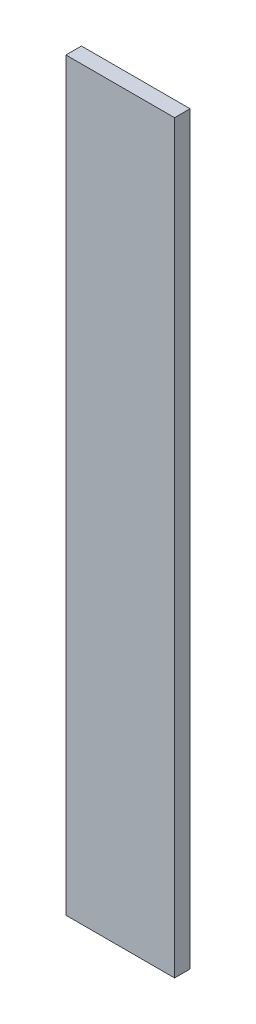
ISO-10303-21;
HEADER;
FILE_DESCRIPTION(('STEP AP214'),'2;1');
FILE_NAME('part.step','',(''),(''),'','','');
FILE_SCHEMA(('AUTOMOTIVE_DESIGN { 1 0 10303 214 1 1 1 1 }'));
ENDSEC;
DATA;
#1=APPLICATION_CONTEXT('core data for automotive mechanical design processes');
#2=APPLICATION_PROTOCOL_DEFINITION('international standard','automotive_design',2000,#1);
#3=PRODUCT_CONTEXT('',#1,'mechanical');
#4=PRODUCT('Part','Part','',(#3));
#5=PRODUCT_RELATED_PRODUCT_CATEGORY('part','',(#4));
#6=PRODUCT_DEFINITION_FORMATION('','',#4);
#7=PRODUCT_DEFINITION_CONTEXT('part definition',#1,'design');
#8=PRODUCT_DEFINITION('design','',#6,#7);
#9=PRODUCT_DEFINITION_SHAPE('','',#8);
#10=(LENGTH_UNIT() NAMED_UNIT(*) SI_UNIT(.MILLI.,.METRE.));
#11=(NAMED_UNIT(*) PLANE_ANGLE_UNIT() SI_UNIT($,.RADIAN.));
#12=(NAMED_UNIT(*) SI_UNIT($,.STERADIAN.) SOLID_ANGLE_UNIT());
#13=UNCERTAINTY_MEASURE_WITH_UNIT(LENGTH_MEASURE(1.E-05),#10,'distance_accuracy_value','');
#14=(GEOMETRIC_REPRESENTATION_CONTEXT(3) GLOBAL_UNCERTAINTY_ASSIGNED_CONTEXT((#13)) GLOBAL_UNIT_ASSIGNED_CONTEXT((#10,
#11,#12)) REPRESENTATION_CONTEXT('',''));
#15=CARTESIAN_POINT('',(0.,0.,0.));
#16=DIRECTION('',(0.,0.,1.));
#17=DIRECTION('',(1.,0.,0.));
#18=AXIS2_PLACEMENT_3D('',#15,#16,#17);
#19=CARTESIAN_POINT('',(0.,304.8,0.));
#20=DIRECTION('',(1.,0.,0.));
#21=DIRECTION('',(0.,0.,-1.));
#22=AXIS2_PLACEMENT_3D('',#19,#20,#21);
#23=PLANE('',#22);
#24=DIRECTION('',(0.,0.,1.));
#25=VECTOR('',#24,1.);
#26=CARTESIAN_POINT('',(0.,0.,0.));
#27=LINE('',#26,#25);
#28=CARTESIAN_POINT('',(0.,0.,-6.35));
#29=VERTEX_POINT('',#28);
#30=CARTESIAN_POINT('',(0.,0.,0.));
#31=VERTEX_POINT('',#30);
#32=EDGE_CURVE('E102',#29,#31,#27,.T.);
#33=ORIENTED_EDGE('',*,*,#32,.T.);
#34=DIRECTION('',(0.,-1.,0.));
#35=VECTOR('',#34,1.);
#36=CARTESIAN_POINT('',(0.,304.8,0.));
#37=LINE('',#36,#35);
#38=CARTESIAN_POINT('',(0.,304.8,0.));
#39=VERTEX_POINT('',#38);
#40=EDGE_CURVE('E11',#39,#31,#37,.T.);
#41=ORIENTED_EDGE('',*,*,#40,.F.);
#42=DIRECTION('',(0.,0.,1.));
#43=VECTOR('',#42,1.);
#44=CARTESIAN_POINT('',(0.,304.8,0.));
#45=LINE('',#44,#43);
#46=CARTESIAN_POINT('',(0.,304.8,-6.35));
#47=VERTEX_POINT('',#46);
#48=EDGE_CURVE('E90',#47,#39,#45,.T.);
#49=ORIENTED_EDGE('',*,*,#48,.F.);
#50=DIRECTION('',(0.,-1.,0.));
#51=VECTOR('',#50,1.);
#52=CARTESIAN_POINT('',(0.,304.8,-6.35));
#53=LINE('',#52,#51);
#54=EDGE_CURVE('E98',#47,#29,#53,.T.);
#55=ORIENTED_EDGE('',*,*,#54,.T.);
#56=EDGE_LOOP('',(#33,#41,#49,#55));
#57=FACE_BOUND('',#56,.T.);
#58=ADVANCED_FACE('F39',(#57),#23,.F.);
#59=CARTESIAN_POINT('',(0.,304.8,0.));
#60=DIRECTION('',(0.,0.,-1.));
#61=DIRECTION('',(-1.,0.,0.));
#62=AXIS2_PLACEMENT_3D('',#59,#60,#61);
#63=PLANE('',#62);
#64=DIRECTION('',(1.,0.,0.));
#65=VECTOR('',#64,1.);
#66=CARTESIAN_POINT('',(0.,0.,0.));
#67=LINE('',#66,#65);
#68=CARTESIAN_POINT('',(44.45,0.,0.));
#69=VERTEX_POINT('',#68);
#70=EDGE_CURVE('E94',#31,#69,#67,.T.);
#71=ORIENTED_EDGE('',*,*,#70,.T.);
#72=DIRECTION('',(0.,-1.,0.));
#73=VECTOR('',#72,1.);
#74=CARTESIAN_POINT('',(44.45,304.8,0.));
#75=LINE('',#74,#73);
#76=CARTESIAN_POINT('',(44.45,304.8,0.));
#77=VERTEX_POINT('',#76);
#78=EDGE_CURVE('E47',#77,#69,#75,.T.);
#79=ORIENTED_EDGE('',*,*,#78,.F.);
#80=DIRECTION('',(1.,0.,0.));
#81=VECTOR('',#80,1.);
#82=CARTESIAN_POINT('',(0.,304.8,0.));
#83=LINE('',#82,#81);
#84=EDGE_CURVE('E85',#39,#77,#83,.T.);
#85=ORIENTED_EDGE('',*,*,#84,.F.);
#86=ORIENTED_EDGE('',*,*,#40,.T.);
#87=EDGE_LOOP('',(#71,#79,#85,#86));
#88=FACE_BOUND('',#87,.T.);
#89=ADVANCED_FACE('F93',(#88),#63,.F.);
#90=CARTESIAN_POINT('',(44.45,304.8,0.));
#91=DIRECTION('',(-1.,0.,0.));
#92=DIRECTION('',(0.,0.,1.));
#93=AXIS2_PLACEMENT_3D('',#90,#91,#92);
#94=PLANE('',#93);
#95=DIRECTION('',(0.,0.,-1.));
#96=VECTOR('',#95,1.);
#97=CARTESIAN_POINT('',(44.45,0.,0.));
#98=LINE('',#97,#96);
#99=CARTESIAN_POINT('',(44.45,0.,-6.35));
#100=VERTEX_POINT('',#99);
#101=EDGE_CURVE('E72',#69,#100,#98,.T.);
#102=ORIENTED_EDGE('',*,*,#101,.T.);
#103=DIRECTION('',(0.,-1.,0.));
#104=VECTOR('',#103,1.);
#105=CARTESIAN_POINT('',(44.45,304.8,-6.35));
#106=LINE('',#105,#104);
#107=CARTESIAN_POINT('',(44.45,304.8,-6.35));
#108=VERTEX_POINT('',#107);
#109=EDGE_CURVE('E95',#108,#100,#106,.T.);
#110=ORIENTED_EDGE('',*,*,#109,.F.);
#111=DIRECTION('',(0.,0.,-1.));
#112=VECTOR('',#111,1.);
#113=CARTESIAN_POINT('',(44.45,304.8,0.));
#114=LINE('',#113,#112);
#115=EDGE_CURVE('E88',#77,#108,#114,.T.);
#116=ORIENTED_EDGE('',*,*,#115,.F.);
#117=ORIENTED_EDGE('',*,*,#78,.T.);
#118=EDGE_LOOP('',(#102,#110,#116,#117));
#119=FACE_BOUND('',#118,.T.);
#120=ADVANCED_FACE('F96',(#119),#94,.F.);
#121=CARTESIAN_POINT('',(0.,304.8,-6.35));
#122=DIRECTION('',(0.,0.,1.));
#123=DIRECTION('',(1.,0.,0.));
#124=AXIS2_PLACEMENT_3D('',#121,#122,#123);
#125=PLANE('',#124);
#126=DIRECTION('',(-1.,0.,0.));
#127=VECTOR('',#126,1.);
#128=CARTESIAN_POINT('',(0.,0.,-6.35));
#129=LINE('',#128,#127);
#130=EDGE_CURVE('E78',#100,#29,#129,.T.);
#131=ORIENTED_EDGE('',*,*,#130,.T.);
#132=ORIENTED_EDGE('',*,*,#54,.F.);
#133=DIRECTION('',(-1.,0.,0.));
#134=VECTOR('',#133,1.);
#135=CARTESIAN_POINT('',(0.,304.8,-6.35));
#136=LINE('',#135,#134);
#137=EDGE_CURVE('E55',#108,#47,#136,.T.);
#138=ORIENTED_EDGE('',*,*,#137,.F.);
#139=ORIENTED_EDGE('',*,*,#109,.T.);
#140=EDGE_LOOP('',(#131,#132,#138,#139));
#141=FACE_BOUND('',#140,.T.);
#142=ADVANCED_FACE('F109',(#141),#125,.F.);
#143=CARTESIAN_POINT('',(0.,304.8,0.));
#144=DIRECTION('',(0.,-1.,0.));
#145=DIRECTION('',(0.,0.,-1.));
#146=AXIS2_PLACEMENT_3D('',#143,#144,#145);
#147=PLANE('',#146);
#148=ORIENTED_EDGE('',*,*,#48,.T.);
#149=ORIENTED_EDGE('',*,*,#84,.T.);
#150=ORIENTED_EDGE('',*,*,#115,.T.);
#151=ORIENTED_EDGE('',*,*,#137,.T.);
#152=EDGE_LOOP('',(#148,#149,#150,#151));
#153=FACE_BOUND('',#152,.T.);
#154=ADVANCED_FACE('F86',(#153),#147,.F.);
#155=CARTESIAN_POINT('',(0.,0.,0.));
#156=DIRECTION('',(0.,-1.,0.));
#157=DIRECTION('',(0.,0.,-1.));
#158=AXIS2_PLACEMENT_3D('',#155,#156,#157);
#159=PLANE('',#158);
#160=ORIENTED_EDGE('',*,*,#32,.F.);
#161=ORIENTED_EDGE('',*,*,#130,.F.);
#162=ORIENTED_EDGE('',*,*,#101,.F.);
#163=ORIENTED_EDGE('',*,*,#70,.F.);
#164=EDGE_LOOP('',(#160,#161,#162,#163));
#165=FACE_BOUND('',#164,.T.);
#166=ADVANCED_FACE('F112',(#165),#159,.T.);
#167=CLOSED_SHELL('',(#58,#89,#120,#142,#154,#166));
#168=MANIFOLD_SOLID_BREP('B2',#167);
#169=ADVANCED_BREP_SHAPE_REPRESENTATION('',(#18,#168),#14);
#170=SHAPE_DEFINITION_REPRESENTATION(#9,#169);
ENDSEC;
END-ISO-10303-21;
